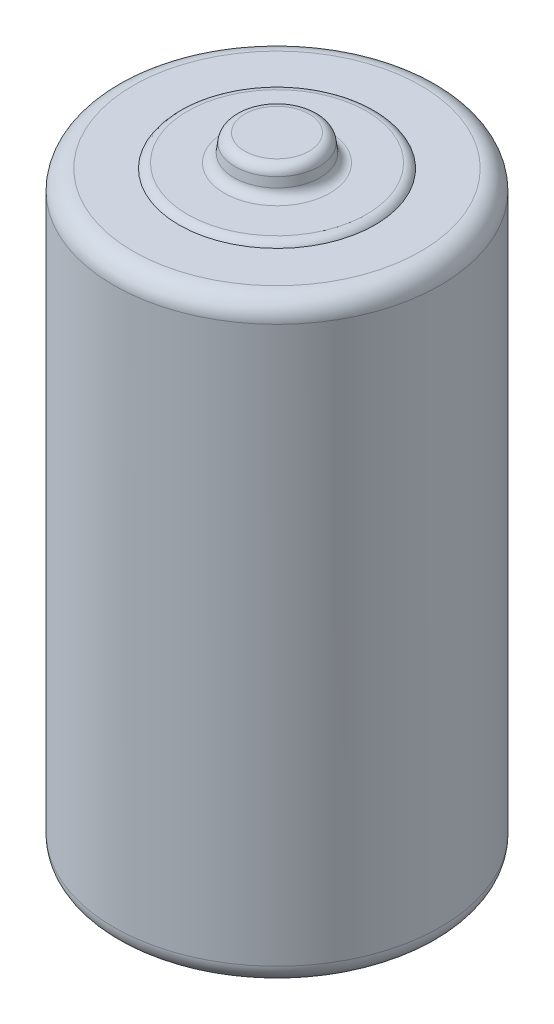
ISO-10303-21;
HEADER;
FILE_DESCRIPTION(('STEP AP214'),'2;1');
FILE_NAME('part.step','',(''),(''),'','','');
FILE_SCHEMA(('AUTOMOTIVE_DESIGN { 1 0 10303 214 1 1 1 1 }'));
ENDSEC;
DATA;
#1=APPLICATION_CONTEXT('core data for automotive mechanical design processes');
#2=APPLICATION_PROTOCOL_DEFINITION('international standard','automotive_design',2000,#1);
#3=PRODUCT_CONTEXT('',#1,'mechanical');
#4=PRODUCT('Part','Part','',(#3));
#5=PRODUCT_RELATED_PRODUCT_CATEGORY('part','',(#4));
#6=PRODUCT_DEFINITION_FORMATION('','',#4);
#7=PRODUCT_DEFINITION_CONTEXT('part definition',#1,'design');
#8=PRODUCT_DEFINITION('design','',#6,#7);
#9=PRODUCT_DEFINITION_SHAPE('','',#8);
#10=(LENGTH_UNIT() NAMED_UNIT(*) SI_UNIT(.MILLI.,.METRE.));
#11=(NAMED_UNIT(*) PLANE_ANGLE_UNIT() SI_UNIT($,.RADIAN.));
#12=(NAMED_UNIT(*) SI_UNIT($,.STERADIAN.) SOLID_ANGLE_UNIT());
#13=UNCERTAINTY_MEASURE_WITH_UNIT(LENGTH_MEASURE(1.E-05),#10,'distance_accuracy_value','');
#14=(GEOMETRIC_REPRESENTATION_CONTEXT(3) GLOBAL_UNCERTAINTY_ASSIGNED_CONTEXT((#13)) GLOBAL_UNIT_ASSIGNED_CONTEXT((#10,
#11,#12)) REPRESENTATION_CONTEXT('',''));
#15=CARTESIAN_POINT('',(0.,0.,0.));
#16=DIRECTION('',(0.,0.,1.));
#17=DIRECTION('',(1.,0.,0.));
#18=AXIS2_PLACEMENT_3D('',#15,#16,#17);
#19=CARTESIAN_POINT('',(0.,0.,0.));
#20=DIRECTION('',(0.,-1.,0.));
#21=DIRECTION('',(0.,0.,-1.));
#22=AXIS2_PLACEMENT_3D('',#19,#20,#21);
#23=CYLINDRICAL_SURFACE('',#22,12.7);
#24=CARTESIAN_POINT('',(0.,2.4892,0.));
#25=DIRECTION('',(0.,-1.,0.));
#26=DIRECTION('',(0.,0.,-1.));
#27=AXIS2_PLACEMENT_3D('',#24,#25,#26);
#28=CIRCLE('',#27,12.7);
#29=CARTESIAN_POINT('',(0.,2.4892,-12.7));
#30=VERTEX_POINT('',#29);
#31=EDGE_CURVE('E63',#30,#30,#28,.F.);
#32=ORIENTED_EDGE('',*,*,#31,.T.);
#33=EDGE_LOOP('',(#32));
#34=FACE_BOUND('',#33,.T.);
#35=CARTESIAN_POINT('',(0.,45.72,0.));
#36=DIRECTION('',(0.,1.,0.));
#37=DIRECTION('',(0.,0.,1.));
#38=AXIS2_PLACEMENT_3D('',#35,#36,#37);
#39=CIRCLE('',#38,12.7);
#40=CARTESIAN_POINT('',(0.,45.72,12.7));
#41=VERTEX_POINT('',#40);
#42=EDGE_CURVE('E66',#41,#41,#39,.F.);
#43=ORIENTED_EDGE('',*,*,#42,.T.);
#44=EDGE_LOOP('',(#43));
#45=FACE_BOUND('',#44,.T.);
#46=ADVANCED_FACE('F31',(#34,#45),#23,.T.);
#47=CARTESIAN_POINT('',(-12.7,47.625,0.));
#48=DIRECTION('',(0.,-1.,0.));
#49=DIRECTION('',(0.,0.,-1.));
#50=AXIS2_PLACEMENT_3D('',#47,#48,#49);
#51=PLANE('',#50);
#52=CARTESIAN_POINT('',(0.,47.625,0.));
#53=DIRECTION('',(0.,-1.,0.));
#54=DIRECTION('',(0.,0.,-1.));
#55=AXIS2_PLACEMENT_3D('',#52,#53,#54);
#56=CIRCLE('',#55,6.96008864231626);
#57=CARTESIAN_POINT('',(0.,47.625,-6.96008864231626));
#58=VERTEX_POINT('',#57);
#59=EDGE_CURVE('E54',#58,#58,#56,.F.);
#60=ORIENTED_EDGE('',*,*,#59,.T.);
#61=EDGE_LOOP('',(#60));
#62=FACE_BOUND('',#61,.T.);
#63=CARTESIAN_POINT('',(0.,47.625,0.));
#64=DIRECTION('',(0.,-1.,0.));
#65=DIRECTION('',(0.,0.,-1.));
#66=AXIS2_PLACEMENT_3D('',#63,#64,#65);
#67=CIRCLE('',#66,4.10168005052544);
#68=CARTESIAN_POINT('',(0.,47.625,-4.10168005052544));
#69=VERTEX_POINT('',#68);
#70=EDGE_CURVE('E57',#69,#69,#67,.T.);
#71=ORIENTED_EDGE('',*,*,#70,.T.);
#72=EDGE_LOOP('',(#71));
#73=FACE_BOUND('',#72,.T.);
#74=ADVANCED_FACE('F103',(#62,#73),#51,.F.);
#75=CARTESIAN_POINT('',(0.,49.657,0.));
#76=DIRECTION('',(0.,-1.,0.));
#77=DIRECTION('',(0.,0.,-1.));
#78=AXIS2_PLACEMENT_3D('',#75,#76,#77);
#79=CONICAL_SURFACE('',#78,3.175,0.124354994546761);
#80=CARTESIAN_POINT('',(0.,48.292485532243,0.));
#81=DIRECTION('',(0.,-1.,0.));
#82=DIRECTION('',(0.,0.,-1.));
#83=AXIS2_PLACEMENT_3D('',#80,#81,#82);
#84=CIRCLE('',#83,3.34556430846962);
#85=CARTESIAN_POINT('',(0.,48.292485532243,-3.34556430846962));
#86=VERTEX_POINT('',#85);
#87=EDGE_CURVE('E46',#86,#86,#84,.F.);
#88=ORIENTED_EDGE('',*,*,#87,.T.);
#89=EDGE_LOOP('',(#88));
#90=FACE_BOUND('',#89,.T.);
#91=CARTESIAN_POINT('',(0.,48.989514467757,0.));
#92=DIRECTION('',(0.,1.,0.));
#93=DIRECTION('',(0.,0.,1.));
#94=AXIS2_PLACEMENT_3D('',#91,#92,#93);
#95=CIRCLE('',#94,3.25843569153038);
#96=CARTESIAN_POINT('',(0.,48.989514467757,3.25843569153038));
#97=VERTEX_POINT('',#96);
#98=EDGE_CURVE('E51',#97,#97,#95,.F.);
#99=ORIENTED_EDGE('',*,*,#98,.T.);
#100=EDGE_LOOP('',(#99));
#101=FACE_BOUND('',#100,.T.);
#102=ADVANCED_FACE('F109',(#90,#101),#79,.T.);
#103=CARTESIAN_POINT('',(-3.175,49.657,0.));
#104=DIRECTION('',(0.,-1.,0.));
#105=DIRECTION('',(0.,0.,-1.));
#106=AXIS2_PLACEMENT_3D('',#103,#104,#105);
#107=PLANE('',#106);
#108=CARTESIAN_POINT('',(0.,49.657,0.));
#109=DIRECTION('',(0.,-1.,0.));
#110=DIRECTION('',(0.,0.,-1.));
#111=AXIS2_PLACEMENT_3D('',#108,#109,#110);
#112=CIRCLE('',#111,2.50231994947456);
#113=CARTESIAN_POINT('',(0.,49.657,-2.50231994947456));
#114=VERTEX_POINT('',#113);
#115=EDGE_CURVE('E42',#114,#114,#112,.F.);
#116=ORIENTED_EDGE('',*,*,#115,.T.);
#117=EDGE_LOOP('',(#116));
#118=FACE_BOUND('',#117,.T.);
#119=ADVANCED_FACE('F148',(#118),#107,.F.);
#120=CARTESIAN_POINT('',(0.,47.244,0.));
#121=DIRECTION('',(0.,1.,0.));
#122=DIRECTION('',(0.,0.,1.));
#123=AXIS2_PLACEMENT_3D('',#120,#121,#122);
#124=PLANE('',#123);
#125=CARTESIAN_POINT('',(0.,47.244,0.));
#126=DIRECTION('',(0.,1.,0.));
#127=DIRECTION('',(0.,0.,1.));
#128=AXIS2_PLACEMENT_3D('',#125,#126,#127);
#129=CIRCLE('',#128,11.176);
#130=CARTESIAN_POINT('',(0.,47.244,11.176));
#131=VERTEX_POINT('',#130);
#132=EDGE_CURVE('E60',#131,#131,#129,.T.);
#133=ORIENTED_EDGE('',*,*,#132,.T.);
#134=EDGE_LOOP('',(#133));
#135=FACE_BOUND('',#134,.T.);
#136=CARTESIAN_POINT('',(0.,47.244,0.));
#137=DIRECTION('',(0.,1.,0.));
#138=DIRECTION('',(0.,0.,1.));
#139=AXIS2_PLACEMENT_3D('',#136,#137,#138);
#140=CIRCLE('',#139,7.62);
#141=CARTESIAN_POINT('',(0.,47.244,7.62));
#142=VERTEX_POINT('',#141);
#143=EDGE_CURVE('E75',#142,#142,#140,.T.);
#144=ORIENTED_EDGE('',*,*,#143,.F.);
#145=EDGE_LOOP('',(#144));
#146=FACE_BOUND('',#145,.T.);
#147=ADVANCED_FACE('F154',(#135,#146),#124,.T.);
#148=CARTESIAN_POINT('',(0.,0.9652,0.));
#149=DIRECTION('',(0.,-1.,0.));
#150=DIRECTION('',(0.,0.,-1.));
#151=AXIS2_PLACEMENT_3D('',#148,#149,#150);
#152=PLANE('',#151);
#153=CARTESIAN_POINT('',(0.,0.9652,0.));
#154=DIRECTION('',(0.,-1.,0.));
#155=DIRECTION('',(0.,0.,-1.));
#156=AXIS2_PLACEMENT_3D('',#153,#154,#155);
#157=CIRCLE('',#156,11.176);
#158=CARTESIAN_POINT('',(0.,0.9652,-11.176));
#159=VERTEX_POINT('',#158);
#160=EDGE_CURVE('E69',#159,#159,#157,.T.);
#161=ORIENTED_EDGE('',*,*,#160,.T.);
#162=EDGE_LOOP('',(#161));
#163=FACE_BOUND('',#162,.T.);
#164=CARTESIAN_POINT('',(0.,0.9652,0.));
#165=DIRECTION('',(0.,-1.,0.));
#166=DIRECTION('',(0.,0.,-1.));
#167=AXIS2_PLACEMENT_3D('',#164,#165,#166);
#168=CIRCLE('',#167,9.1186);
#169=CARTESIAN_POINT('',(0.,0.9652,-9.1186));
#170=VERTEX_POINT('',#169);
#171=EDGE_CURVE('E78',#170,#170,#168,.T.);
#172=ORIENTED_EDGE('',*,*,#171,.F.);
#173=EDGE_LOOP('',(#172));
#174=FACE_BOUND('',#173,.T.);
#175=ADVANCED_FACE('F119',(#163,#174),#152,.T.);
#176=CARTESIAN_POINT('',(0.,0.,0.));
#177=DIRECTION('',(0.,1.,0.));
#178=DIRECTION('',(0.,0.,1.));
#179=AXIS2_PLACEMENT_3D('',#176,#177,#178);
#180=PLANE('',#179);
#181=CARTESIAN_POINT('',(0.,0.,0.));
#182=DIRECTION('',(0.,1.,0.));
#183=DIRECTION('',(0.,0.,1.));
#184=AXIS2_PLACEMENT_3D('',#181,#182,#183);
#185=CIRCLE('',#184,7.70074296912559);
#186=CARTESIAN_POINT('',(0.,0.,7.70074296912559));
#187=VERTEX_POINT('',#186);
#188=EDGE_CURVE('E72',#187,#187,#185,.F.);
#189=ORIENTED_EDGE('',*,*,#188,.T.);
#190=EDGE_LOOP('',(#189));
#191=FACE_BOUND('',#190,.T.);
#192=CARTESIAN_POINT('',(0.,0.,0.));
#193=DIRECTION('',(0.,-1.,0.));
#194=DIRECTION('',(0.,0.,-1.));
#195=AXIS2_PLACEMENT_3D('',#192,#193,#194);
#196=CIRCLE('',#195,5.08);
#197=CARTESIAN_POINT('',(0.,0.,-5.08));
#198=VERTEX_POINT('',#197);
#199=EDGE_CURVE('E81',#198,#198,#196,.T.);
#200=ORIENTED_EDGE('',*,*,#199,.F.);
#201=EDGE_LOOP('',(#200));
#202=FACE_BOUND('',#201,.T.);
#203=ADVANCED_FACE('F115',(#191,#202),#180,.F.);
#204=CARTESIAN_POINT('',(0.,0.381,0.));
#205=DIRECTION('',(0.,-1.,0.));
#206=DIRECTION('',(0.,0.,-1.));
#207=AXIS2_PLACEMENT_3D('',#204,#205,#206);
#208=PLANE('',#207);
#209=CARTESIAN_POINT('',(0.,0.381,0.));
#210=DIRECTION('',(0.,-1.,0.));
#211=DIRECTION('',(0.,0.,-1.));
#212=AXIS2_PLACEMENT_3D('',#209,#210,#211);
#213=CIRCLE('',#212,4.39198711325939);
#214=CARTESIAN_POINT('',(0.,0.381,-4.39198711325939));
#215=VERTEX_POINT('',#214);
#216=EDGE_CURVE('E10',#215,#215,#213,.F.);
#217=ORIENTED_EDGE('',*,*,#216,.T.);
#218=EDGE_LOOP('',(#217));
#219=FACE_BOUND('',#218,.T.);
#220=CARTESIAN_POINT('',(0.,0.381,0.));
#221=DIRECTION('',(0.,-1.,0.));
#222=DIRECTION('',(0.,0.,-1.));
#223=AXIS2_PLACEMENT_3D('',#220,#221,#222);
#224=CIRCLE('',#223,4.49801288674061);
#225=CARTESIAN_POINT('',(0.,0.381,-4.49801288674061));
#226=VERTEX_POINT('',#225);
#227=EDGE_CURVE('E38',#226,#226,#224,.T.);
#228=ORIENTED_EDGE('',*,*,#227,.T.);
#229=EDGE_LOOP('',(#228));
#230=FACE_BOUND('',#229,.T.);
#231=ADVANCED_FACE('F118',(#219,#230),#208,.T.);
#232=CARTESIAN_POINT('',(0.,0.,0.));
#233=DIRECTION('',(0.,-1.,0.));
#234=DIRECTION('',(0.,0.,-1.));
#235=AXIS2_PLACEMENT_3D('',#232,#233,#234);
#236=CIRCLE('',#235,3.81);
#237=CARTESIAN_POINT('',(0.,0.,-3.81));
#238=VERTEX_POINT('',#237);
#239=EDGE_CURVE('E84',#238,#238,#236,.T.);
#240=ORIENTED_EDGE('',*,*,#239,.T.);
#241=EDGE_LOOP('',(#240));
#242=FACE_BOUND('',#241,.T.);
#243=ADVANCED_FACE('F88',(#242),#180,.F.);
#244=CARTESIAN_POINT('',(0.,1.524,0.));
#245=DIRECTION('',(0.,-1.,0.));
#246=DIRECTION('',(0.,0.,-1.));
#247=AXIS2_PLACEMENT_3D('',#244,#245,#246);
#248=TOROIDAL_SURFACE('',#247,7.70074296912559,1.524);
#249=ORIENTED_EDGE('',*,*,#171,.T.);
#250=EDGE_LOOP('',(#249));
#251=FACE_BOUND('',#250,.T.);
#252=ORIENTED_EDGE('',*,*,#188,.F.);
#253=EDGE_LOOP('',(#252));
#254=FACE_BOUND('',#253,.T.);
#255=ADVANCED_FACE('F121',(#251,#254),#248,.T.);
#256=CARTESIAN_POINT('',(0.,2.4892,0.));
#257=DIRECTION('',(0.,-1.,0.));
#258=DIRECTION('',(0.,0.,-1.));
#259=AXIS2_PLACEMENT_3D('',#256,#257,#258);
#260=TOROIDAL_SURFACE('',#259,11.176,1.524);
#261=ORIENTED_EDGE('',*,*,#31,.F.);
#262=EDGE_LOOP('',(#261));
#263=FACE_BOUND('',#262,.T.);
#264=ORIENTED_EDGE('',*,*,#160,.F.);
#265=EDGE_LOOP('',(#264));
#266=FACE_BOUND('',#265,.T.);
#267=ADVANCED_FACE('F124',(#263,#266),#260,.T.);
#268=CARTESIAN_POINT('',(0.,45.72,0.));
#269=DIRECTION('',(0.,1.,0.));
#270=DIRECTION('',(0.,0.,1.));
#271=AXIS2_PLACEMENT_3D('',#268,#269,#270);
#272=TOROIDAL_SURFACE('',#271,11.176,1.524);
#273=ORIENTED_EDGE('',*,*,#42,.F.);
#274=EDGE_LOOP('',(#273));
#275=FACE_BOUND('',#274,.T.);
#276=ORIENTED_EDGE('',*,*,#132,.F.);
#277=EDGE_LOOP('',(#276));
#278=FACE_BOUND('',#277,.T.);
#279=ADVANCED_FACE('F128',(#275,#278),#272,.T.);
#280=CARTESIAN_POINT('',(0.,46.863,0.));
#281=DIRECTION('',(0.,1.,0.));
#282=DIRECTION('',(0.,0.,1.));
#283=AXIS2_PLACEMENT_3D('',#280,#281,#282);
#284=TOROIDAL_SURFACE('',#283,6.96008864231626,0.762);
#285=ORIENTED_EDGE('',*,*,#143,.T.);
#286=EDGE_LOOP('',(#285));
#287=FACE_BOUND('',#286,.T.);
#288=ORIENTED_EDGE('',*,*,#59,.F.);
#289=EDGE_LOOP('',(#288));
#290=FACE_BOUND('',#289,.T.);
#291=ADVANCED_FACE('F132',(#287,#290),#284,.T.);
#292=CARTESIAN_POINT('',(0.,48.387,0.));
#293=DIRECTION('',(0.,-1.,0.));
#294=DIRECTION('',(0.,0.,-1.));
#295=AXIS2_PLACEMENT_3D('',#292,#293,#294);
#296=TOROIDAL_SURFACE('',#295,4.10168005052544,0.762);
#297=ORIENTED_EDGE('',*,*,#87,.F.);
#298=EDGE_LOOP('',(#297));
#299=FACE_BOUND('',#298,.T.);
#300=ORIENTED_EDGE('',*,*,#70,.F.);
#301=EDGE_LOOP('',(#300));
#302=FACE_BOUND('',#301,.T.);
#303=ADVANCED_FACE('F99',(#299,#302),#296,.F.);
#304=CARTESIAN_POINT('',(0.,48.895,0.));
#305=DIRECTION('',(0.,-1.,0.));
#306=DIRECTION('',(0.,0.,-1.));
#307=AXIS2_PLACEMENT_3D('',#304,#305,#306);
#308=TOROIDAL_SURFACE('',#307,2.50231994947456,0.762);
#309=ORIENTED_EDGE('',*,*,#115,.F.);
#310=EDGE_LOOP('',(#309));
#311=FACE_BOUND('',#310,.T.);
#312=ORIENTED_EDGE('',*,*,#98,.F.);
#313=EDGE_LOOP('',(#312));
#314=FACE_BOUND('',#313,.T.);
#315=ADVANCED_FACE('F92',(#311,#314),#308,.T.);
#316=CARTESIAN_POINT('',(0.,-0.254,0.));
#317=DIRECTION('',(0.,-1.,0.));
#318=DIRECTION('',(0.,0.,-1.));
#319=AXIS2_PLACEMENT_3D('',#316,#317,#318);
#320=TOROIDAL_SURFACE('',#319,4.39198711325939,0.635);
#321=ORIENTED_EDGE('',*,*,#216,.F.);
#322=EDGE_LOOP('',(#321));
#323=FACE_BOUND('',#322,.T.);
#324=ORIENTED_EDGE('',*,*,#239,.F.);
#325=EDGE_LOOP('',(#324));
#326=FACE_BOUND('',#325,.T.);
#327=ADVANCED_FACE('F90',(#323,#326),#320,.F.);
#328=CARTESIAN_POINT('',(0.,-0.254,0.));
#329=DIRECTION('',(0.,1.,0.));
#330=DIRECTION('',(0.,0.,1.));
#331=AXIS2_PLACEMENT_3D('',#328,#329,#330);
#332=TOROIDAL_SURFACE('',#331,4.49801288674061,0.635);
#333=ORIENTED_EDGE('',*,*,#199,.T.);
#334=EDGE_LOOP('',(#333));
#335=FACE_BOUND('',#334,.T.);
#336=ORIENTED_EDGE('',*,*,#227,.F.);
#337=EDGE_LOOP('',(#336));
#338=FACE_BOUND('',#337,.T.);
#339=ADVANCED_FACE('F33',(#335,#338),#332,.F.);
#340=CLOSED_SHELL('',(#46,#74,#102,#119,#147,#175,#203,#231,#243,#255,#267,#279,#291,#303,#315,
#327,#339));
#341=MANIFOLD_SOLID_BREP('B2',#340);
#342=ADVANCED_BREP_SHAPE_REPRESENTATION('',(#18,#341),#14);
#343=SHAPE_DEFINITION_REPRESENTATION(#9,#342);
ENDSEC;
END-ISO-10303-21;
